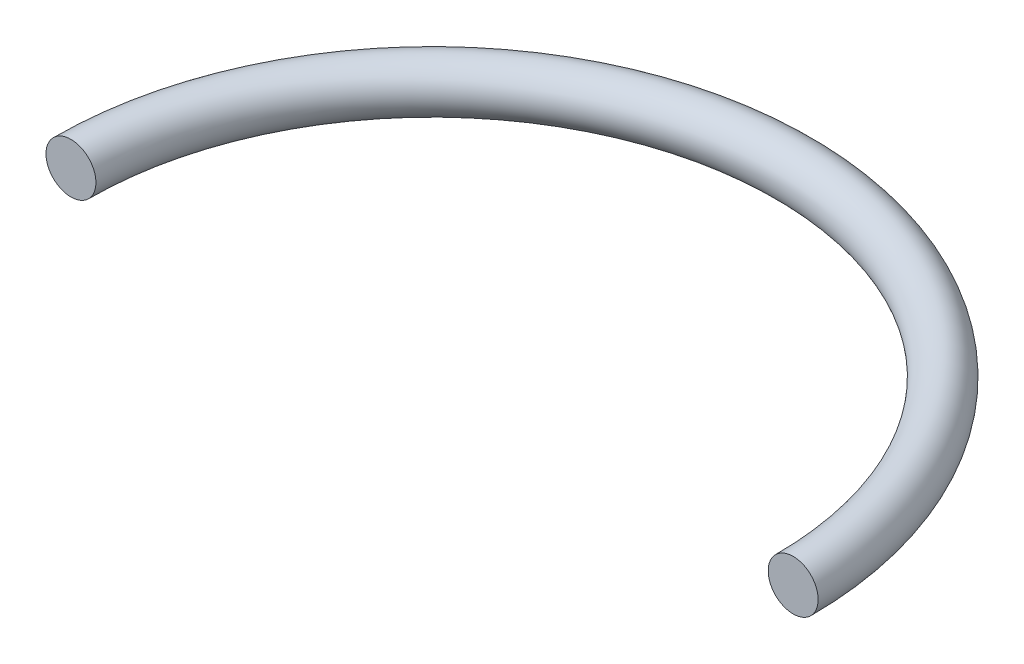
ISO-10303-21;
HEADER;
FILE_DESCRIPTION(('STEP AP214'),'2;1');
FILE_NAME('part.step','',(''),(''),'','','');
FILE_SCHEMA(('AUTOMOTIVE_DESIGN { 1 0 10303 214 1 1 1 1 }'));
ENDSEC;
DATA;
#1=APPLICATION_CONTEXT('core data for automotive mechanical design processes');
#2=APPLICATION_PROTOCOL_DEFINITION('international standard','automotive_design',2000,#1);
#3=PRODUCT_CONTEXT('',#1,'mechanical');
#4=PRODUCT('Part','Part','',(#3));
#5=PRODUCT_RELATED_PRODUCT_CATEGORY('part','',(#4));
#6=PRODUCT_DEFINITION_FORMATION('','',#4);
#7=PRODUCT_DEFINITION_CONTEXT('part definition',#1,'design');
#8=PRODUCT_DEFINITION('design','',#6,#7);
#9=PRODUCT_DEFINITION_SHAPE('','',#8);
#10=(LENGTH_UNIT() NAMED_UNIT(*) SI_UNIT(.MILLI.,.METRE.));
#11=(NAMED_UNIT(*) PLANE_ANGLE_UNIT() SI_UNIT($,.RADIAN.));
#12=(NAMED_UNIT(*) SI_UNIT($,.STERADIAN.) SOLID_ANGLE_UNIT());
#13=UNCERTAINTY_MEASURE_WITH_UNIT(LENGTH_MEASURE(1.E-05),#10,'distance_accuracy_value','');
#14=(GEOMETRIC_REPRESENTATION_CONTEXT(3) GLOBAL_UNCERTAINTY_ASSIGNED_CONTEXT((#13)) GLOBAL_UNIT_ASSIGNED_CONTEXT((#10,
#11,#12)) REPRESENTATION_CONTEXT('',''));
#15=CARTESIAN_POINT('',(0.,0.,0.));
#16=DIRECTION('',(0.,0.,1.));
#17=DIRECTION('',(1.,0.,0.));
#18=AXIS2_PLACEMENT_3D('',#15,#16,#17);
#19=CARTESIAN_POINT('',(0.,0.,0.));
#20=DIRECTION('',(0.,1.,0.));
#21=DIRECTION('',(0.,0.,1.));
#22=AXIS2_PLACEMENT_3D('',#19,#20,#21);
#23=TOROIDAL_SURFACE('',#22,9.4,0.649999999999999);
#24=CARTESIAN_POINT('',(9.4,0.,0.));
#25=DIRECTION('',(0.,0.,-1.));
#26=DIRECTION('',(-1.,0.,0.));
#27=AXIS2_PLACEMENT_3D('',#24,#25,#26);
#28=CIRCLE('',#27,0.649999999999999);
#29=CARTESIAN_POINT('',(10.05,0.,0.));
#30=VERTEX_POINT('',#29);
#31=EDGE_CURVE('E10',#30,#30,#28,.T.);
#32=CARTESIAN_POINT('',(-9.4,0.,0.));
#33=DIRECTION('',(0.,0.,1.));
#34=DIRECTION('',(1.,0.,0.));
#35=AXIS2_PLACEMENT_3D('',#32,#33,#34);
#36=CIRCLE('',#35,0.649999999999999);
#37=CARTESIAN_POINT('',(-10.05,0.,0.));
#38=VERTEX_POINT('',#37);
#39=EDGE_CURVE('E37',#38,#38,#36,.T.);
#40=CARTESIAN_POINT('',(0.,0.,0.));
#41=DIRECTION('',(0.,1.,0.));
#42=DIRECTION('',(0.,0.,1.));
#43=AXIS2_PLACEMENT_3D('',#40,#41,#42);
#44=CIRCLE('',#43,10.05);
#45=EDGE_CURVE('',#30,#38,#44,.T.);
#46=ORIENTED_EDGE('',*,*,#31,.T.);
#47=ORIENTED_EDGE('',*,*,#39,.F.);
#48=ORIENTED_EDGE('',*,*,#45,.T.);
#49=ORIENTED_EDGE('',*,*,#45,.F.);
#50=EDGE_LOOP('',(#46,#48,#47,#49));
#51=FACE_BOUND('',#50,.T.);
#52=ADVANCED_FACE('F31',(#51),#23,.T.);
#53=CARTESIAN_POINT('',(9.4,0.,0.));
#54=DIRECTION('',(0.,0.,-1.));
#55=DIRECTION('',(-1.,0.,0.));
#56=AXIS2_PLACEMENT_3D('',#53,#54,#55);
#57=PLANE('',#56);
#58=ORIENTED_EDGE('',*,*,#31,.F.);
#59=EDGE_LOOP('',(#58));
#60=FACE_BOUND('',#59,.T.);
#61=ADVANCED_FACE('F46',(#60),#57,.F.);
#62=CARTESIAN_POINT('',(-9.4,0.,0.));
#63=DIRECTION('',(0.,0.,1.));
#64=DIRECTION('',(1.,0.,0.));
#65=AXIS2_PLACEMENT_3D('',#62,#63,#64);
#66=PLANE('',#65);
#67=ORIENTED_EDGE('',*,*,#39,.T.);
#68=EDGE_LOOP('',(#67));
#69=FACE_BOUND('',#68,.T.);
#70=ADVANCED_FACE('F43',(#69),#66,.T.);
#71=CLOSED_SHELL('',(#52,#61,#70));
#72=MANIFOLD_SOLID_BREP('B2',#71);
#73=ADVANCED_BREP_SHAPE_REPRESENTATION('',(#18,#72),#14);
#74=SHAPE_DEFINITION_REPRESENTATION(#9,#73);
ENDSEC;
END-ISO-10303-21;
